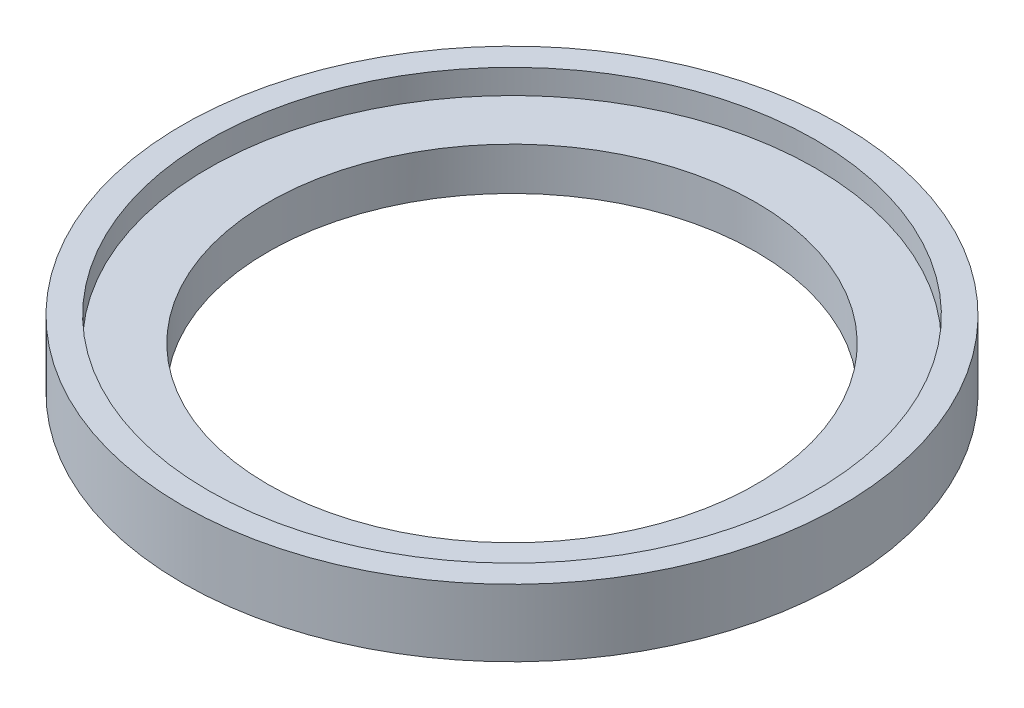
ISO-10303-21;
HEADER;
FILE_DESCRIPTION(('STEP AP214'),'2;1');
FILE_NAME('part.step','',(''),(''),'','','');
FILE_SCHEMA(('AUTOMOTIVE_DESIGN { 1 0 10303 214 1 1 1 1 }'));
ENDSEC;
DATA;
#1=APPLICATION_CONTEXT('core data for automotive mechanical design processes');
#2=APPLICATION_PROTOCOL_DEFINITION('international standard','automotive_design',2000,#1);
#3=PRODUCT_CONTEXT('',#1,'mechanical');
#4=PRODUCT('Part','Part','',(#3));
#5=PRODUCT_RELATED_PRODUCT_CATEGORY('part','',(#4));
#6=PRODUCT_DEFINITION_FORMATION('','',#4);
#7=PRODUCT_DEFINITION_CONTEXT('part definition',#1,'design');
#8=PRODUCT_DEFINITION('design','',#6,#7);
#9=PRODUCT_DEFINITION_SHAPE('','',#8);
#10=(LENGTH_UNIT() NAMED_UNIT(*) SI_UNIT(.MILLI.,.METRE.));
#11=(NAMED_UNIT(*) PLANE_ANGLE_UNIT() SI_UNIT($,.RADIAN.));
#12=(NAMED_UNIT(*) SI_UNIT($,.STERADIAN.) SOLID_ANGLE_UNIT());
#13=UNCERTAINTY_MEASURE_WITH_UNIT(LENGTH_MEASURE(1.E-05),#10,'distance_accuracy_value','');
#14=(GEOMETRIC_REPRESENTATION_CONTEXT(3) GLOBAL_UNCERTAINTY_ASSIGNED_CONTEXT((#13)) GLOBAL_UNIT_ASSIGNED_CONTEXT((#10,
#11,#12)) REPRESENTATION_CONTEXT('',''));
#15=CARTESIAN_POINT('',(0.,0.,0.));
#16=DIRECTION('',(0.,0.,1.));
#17=DIRECTION('',(1.,0.,0.));
#18=AXIS2_PLACEMENT_3D('',#15,#16,#17);
#19=CARTESIAN_POINT('',(0.,2.5,0.));
#20=DIRECTION('',(0.,1.,0.));
#21=DIRECTION('',(0.,0.,1.));
#22=AXIS2_PLACEMENT_3D('',#19,#20,#21);
#23=PLANE('',#22);
#24=CARTESIAN_POINT('',(0.,2.5,0.));
#25=DIRECTION('',(0.,1.,0.));
#26=DIRECTION('',(0.,0.,1.));
#27=AXIS2_PLACEMENT_3D('',#24,#25,#26);
#28=CIRCLE('',#27,40.);
#29=CARTESIAN_POINT('',(0.,2.5,40.));
#30=VERTEX_POINT('',#29);
#31=EDGE_CURVE('E51',#30,#30,#28,.T.);
#32=ORIENTED_EDGE('',*,*,#31,.F.);
#33=EDGE_LOOP('',(#32));
#34=FACE_BOUND('',#33,.T.);
#35=CARTESIAN_POINT('',(0.,2.5,0.));
#36=DIRECTION('',(0.,1.,0.));
#37=DIRECTION('',(0.,0.,1.));
#38=AXIS2_PLACEMENT_3D('',#35,#36,#37);
#39=CIRCLE('',#38,49.75);
#40=CARTESIAN_POINT('',(0.,2.5,49.75));
#41=VERTEX_POINT('',#40);
#42=EDGE_CURVE('E47',#41,#41,#39,.F.);
#43=ORIENTED_EDGE('',*,*,#42,.F.);
#44=EDGE_LOOP('',(#43));
#45=FACE_BOUND('',#44,.T.);
#46=ADVANCED_FACE('F40',(#34,#45),#23,.T.);
#47=CARTESIAN_POINT('',(0.,0.,0.));
#48=DIRECTION('',(0.,1.,0.));
#49=DIRECTION('',(0.,0.,1.));
#50=AXIS2_PLACEMENT_3D('',#47,#48,#49);
#51=PLANE('',#50);
#52=CARTESIAN_POINT('',(0.,0.,0.));
#53=DIRECTION('',(0.,-1.,0.));
#54=DIRECTION('',(0.,0.,-1.));
#55=AXIS2_PLACEMENT_3D('',#52,#53,#54);
#56=CIRCLE('',#55,49.5);
#57=CARTESIAN_POINT('',(0.,0.,-49.5));
#58=VERTEX_POINT('',#57);
#59=EDGE_CURVE('E70',#58,#58,#56,.T.);
#60=ORIENTED_EDGE('',*,*,#59,.T.);
#61=EDGE_LOOP('',(#60));
#62=FACE_BOUND('',#61,.T.);
#63=CARTESIAN_POINT('',(0.,0.,0.));
#64=DIRECTION('',(0.,1.,0.));
#65=DIRECTION('',(0.,0.,1.));
#66=AXIS2_PLACEMENT_3D('',#63,#64,#65);
#67=CIRCLE('',#66,44.5);
#68=CARTESIAN_POINT('',(0.,0.,44.5));
#69=VERTEX_POINT('',#68);
#70=EDGE_CURVE('E11',#69,#69,#67,.F.);
#71=ORIENTED_EDGE('',*,*,#70,.F.);
#72=EDGE_LOOP('',(#71));
#73=FACE_BOUND('',#72,.T.);
#74=ADVANCED_FACE('F90',(#62,#73),#51,.F.);
#75=CARTESIAN_POINT('',(0.,2.5,0.));
#76=DIRECTION('',(0.,-1.,0.));
#77=DIRECTION('',(0.,0.,-1.));
#78=AXIS2_PLACEMENT_3D('',#75,#76,#77);
#79=CYLINDRICAL_SURFACE('',#78,54.);
#80=CARTESIAN_POINT('',(0.,6.5,0.));
#81=DIRECTION('',(0.,1.,0.));
#82=DIRECTION('',(0.,0.,1.));
#83=AXIS2_PLACEMENT_3D('',#80,#81,#82);
#84=CIRCLE('',#83,54.);
#85=CARTESIAN_POINT('',(0.,6.5,54.));
#86=VERTEX_POINT('',#85);
#87=EDGE_CURVE('E55',#86,#86,#84,.T.);
#88=ORIENTED_EDGE('',*,*,#87,.F.);
#89=EDGE_LOOP('',(#88));
#90=FACE_BOUND('',#89,.T.);
#91=CARTESIAN_POINT('',(0.,-4.5,0.));
#92=DIRECTION('',(0.,-1.,0.));
#93=DIRECTION('',(0.,0.,-1.));
#94=AXIS2_PLACEMENT_3D('',#91,#92,#93);
#95=CIRCLE('',#94,54.);
#96=CARTESIAN_POINT('',(0.,-4.5,-54.));
#97=VERTEX_POINT('',#96);
#98=EDGE_CURVE('E69',#97,#97,#95,.T.);
#99=ORIENTED_EDGE('',*,*,#98,.F.);
#100=EDGE_LOOP('',(#99));
#101=FACE_BOUND('',#100,.T.);
#102=ADVANCED_FACE('F42',(#90,#101),#79,.T.);
#103=CARTESIAN_POINT('',(0.,2.5,0.));
#104=DIRECTION('',(0.,-1.,0.));
#105=DIRECTION('',(0.,0.,-1.));
#106=AXIS2_PLACEMENT_3D('',#103,#104,#105);
#107=CYLINDRICAL_SURFACE('',#106,40.);
#108=ORIENTED_EDGE('',*,*,#31,.T.);
#109=EDGE_LOOP('',(#108));
#110=FACE_BOUND('',#109,.T.);
#111=CARTESIAN_POINT('',(0.,-4.5,0.));
#112=DIRECTION('',(0.,-1.,0.));
#113=DIRECTION('',(0.,0.,-1.));
#114=AXIS2_PLACEMENT_3D('',#111,#112,#113);
#115=CIRCLE('',#114,40.);
#116=CARTESIAN_POINT('',(0.,-4.5,-40.));
#117=VERTEX_POINT('',#116);
#118=EDGE_CURVE('E66',#117,#117,#115,.F.);
#119=ORIENTED_EDGE('',*,*,#118,.F.);
#120=EDGE_LOOP('',(#119));
#121=FACE_BOUND('',#120,.T.);
#122=ADVANCED_FACE('F89',(#110,#121),#107,.F.);
#123=CARTESIAN_POINT('',(0.,6.5,0.));
#124=DIRECTION('',(0.,1.,0.));
#125=DIRECTION('',(0.,0.,1.));
#126=AXIS2_PLACEMENT_3D('',#123,#124,#125);
#127=PLANE('',#126);
#128=ORIENTED_EDGE('',*,*,#87,.T.);
#129=EDGE_LOOP('',(#128));
#130=FACE_BOUND('',#129,.T.);
#131=CARTESIAN_POINT('',(0.,6.5,0.));
#132=DIRECTION('',(0.,1.,0.));
#133=DIRECTION('',(0.,0.,1.));
#134=AXIS2_PLACEMENT_3D('',#131,#132,#133);
#135=CIRCLE('',#134,49.75);
#136=CARTESIAN_POINT('',(0.,6.5,49.75));
#137=VERTEX_POINT('',#136);
#138=EDGE_CURVE('E60',#137,#137,#135,.T.);
#139=ORIENTED_EDGE('',*,*,#138,.F.);
#140=EDGE_LOOP('',(#139));
#141=FACE_BOUND('',#140,.T.);
#142=ADVANCED_FACE('F96',(#130,#141),#127,.T.);
#143=CARTESIAN_POINT('',(0.,6.5,0.));
#144=DIRECTION('',(0.,-1.,0.));
#145=DIRECTION('',(0.,0.,-1.));
#146=AXIS2_PLACEMENT_3D('',#143,#144,#145);
#147=CYLINDRICAL_SURFACE('',#146,49.75);
#148=ORIENTED_EDGE('',*,*,#138,.T.);
#149=EDGE_LOOP('',(#148));
#150=FACE_BOUND('',#149,.T.);
#151=ORIENTED_EDGE('',*,*,#42,.T.);
#152=EDGE_LOOP('',(#151));
#153=FACE_BOUND('',#152,.T.);
#154=ADVANCED_FACE('F111',(#150,#153),#147,.F.);
#155=CARTESIAN_POINT('',(0.,-4.5,0.));
#156=DIRECTION('',(0.,1.,0.));
#157=DIRECTION('',(0.,0.,1.));
#158=AXIS2_PLACEMENT_3D('',#155,#156,#157);
#159=CYLINDRICAL_SURFACE('',#158,44.5);
#160=CARTESIAN_POINT('',(0.,-4.5,0.));
#161=DIRECTION('',(0.,-1.,0.));
#162=DIRECTION('',(0.,0.,-1.));
#163=AXIS2_PLACEMENT_3D('',#160,#161,#162);
#164=CIRCLE('',#163,44.5);
#165=CARTESIAN_POINT('',(0.,-4.5,-44.5));
#166=VERTEX_POINT('',#165);
#167=EDGE_CURVE('E63',#166,#166,#164,.T.);
#168=ORIENTED_EDGE('',*,*,#167,.F.);
#169=EDGE_LOOP('',(#168));
#170=FACE_BOUND('',#169,.T.);
#171=ORIENTED_EDGE('',*,*,#70,.T.);
#172=EDGE_LOOP('',(#171));
#173=FACE_BOUND('',#172,.T.);
#174=ADVANCED_FACE('F115',(#170,#173),#159,.T.);
#175=CARTESIAN_POINT('',(0.,-4.5,0.));
#176=DIRECTION('',(0.,-1.,0.));
#177=DIRECTION('',(0.,0.,-1.));
#178=AXIS2_PLACEMENT_3D('',#175,#176,#177);
#179=PLANE('',#178);
#180=ORIENTED_EDGE('',*,*,#118,.T.);
#181=EDGE_LOOP('',(#180));
#182=FACE_BOUND('',#181,.T.);
#183=ORIENTED_EDGE('',*,*,#167,.T.);
#184=EDGE_LOOP('',(#183));
#185=FACE_BOUND('',#184,.T.);
#186=ADVANCED_FACE('F119',(#182,#185),#179,.T.);
#187=CARTESIAN_POINT('',(0.,-4.5,0.));
#188=DIRECTION('',(0.,1.,0.));
#189=DIRECTION('',(0.,0.,1.));
#190=AXIS2_PLACEMENT_3D('',#187,#188,#189);
#191=CYLINDRICAL_SURFACE('',#190,49.5);
#192=CARTESIAN_POINT('',(0.,-4.5,0.));
#193=DIRECTION('',(0.,-1.,0.));
#194=DIRECTION('',(0.,0.,-1.));
#195=AXIS2_PLACEMENT_3D('',#192,#193,#194);
#196=CIRCLE('',#195,49.5);
#197=CARTESIAN_POINT('',(0.,-4.5,-49.5));
#198=VERTEX_POINT('',#197);
#199=EDGE_CURVE('E73',#198,#198,#196,.T.);
#200=ORIENTED_EDGE('',*,*,#199,.T.);
#201=EDGE_LOOP('',(#200));
#202=FACE_BOUND('',#201,.T.);
#203=ORIENTED_EDGE('',*,*,#59,.F.);
#204=EDGE_LOOP('',(#203));
#205=FACE_BOUND('',#204,.T.);
#206=ADVANCED_FACE('F79',(#202,#205),#191,.F.);
#207=CARTESIAN_POINT('',(0.,-4.5,0.));
#208=DIRECTION('',(0.,-1.,0.));
#209=DIRECTION('',(0.,0.,-1.));
#210=AXIS2_PLACEMENT_3D('',#207,#208,#209);
#211=PLANE('',#210);
#212=ORIENTED_EDGE('',*,*,#199,.F.);
#213=EDGE_LOOP('',(#212));
#214=FACE_BOUND('',#213,.T.);
#215=ORIENTED_EDGE('',*,*,#98,.T.);
#216=EDGE_LOOP('',(#215));
#217=FACE_BOUND('',#216,.T.);
#218=ADVANCED_FACE('F82',(#214,#217),#211,.T.);
#219=CLOSED_SHELL('',(#46,#74,#102,#122,#142,#154,#174,#186,#206,#218));
#220=MANIFOLD_SOLID_BREP('B2',#219);
#221=ADVANCED_BREP_SHAPE_REPRESENTATION('',(#18,#220),#14);
#222=SHAPE_DEFINITION_REPRESENTATION(#9,#221);
ENDSEC;
END-ISO-10303-21;
